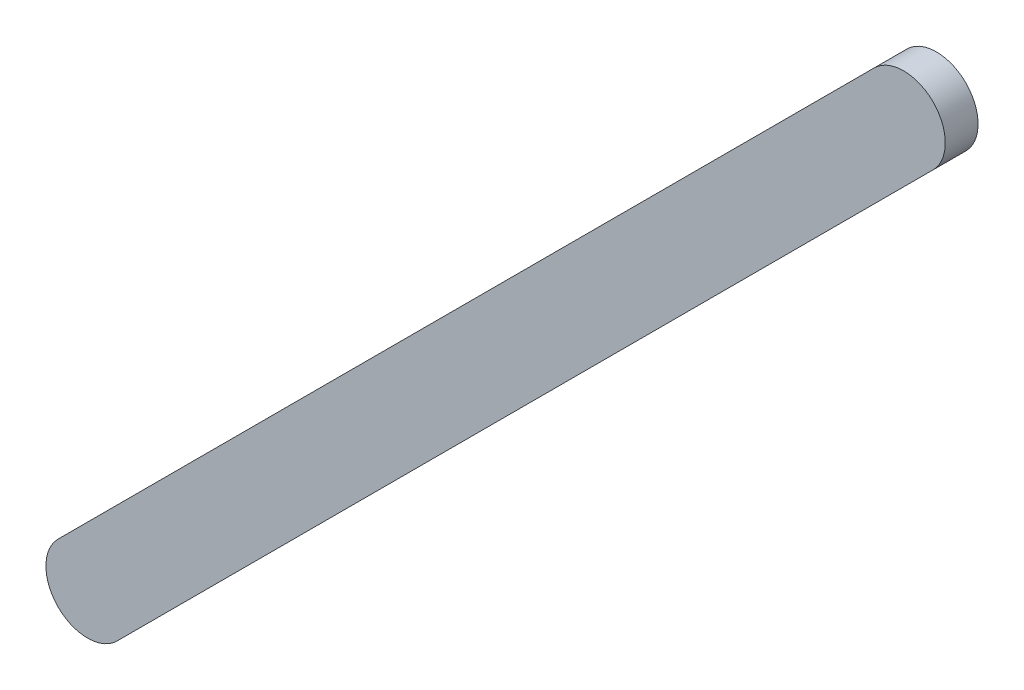
ISO-10303-21;
HEADER;
FILE_DESCRIPTION(('STEP AP214'),'2;1');
FILE_NAME('part.step','',(''),(''),'','','');
FILE_SCHEMA(('AUTOMOTIVE_DESIGN { 1 0 10303 214 1 1 1 1 }'));
ENDSEC;
DATA;
#1=APPLICATION_CONTEXT('core data for automotive mechanical design processes');
#2=APPLICATION_PROTOCOL_DEFINITION('international standard','automotive_design',2000,#1);
#3=PRODUCT_CONTEXT('',#1,'mechanical');
#4=PRODUCT('Part','Part','',(#3));
#5=PRODUCT_RELATED_PRODUCT_CATEGORY('part','',(#4));
#6=PRODUCT_DEFINITION_FORMATION('','',#4);
#7=PRODUCT_DEFINITION_CONTEXT('part definition',#1,'design');
#8=PRODUCT_DEFINITION('design','',#6,#7);
#9=PRODUCT_DEFINITION_SHAPE('','',#8);
#10=(LENGTH_UNIT() NAMED_UNIT(*) SI_UNIT(.MILLI.,.METRE.));
#11=(NAMED_UNIT(*) PLANE_ANGLE_UNIT() SI_UNIT($,.RADIAN.));
#12=(NAMED_UNIT(*) SI_UNIT($,.STERADIAN.) SOLID_ANGLE_UNIT());
#13=UNCERTAINTY_MEASURE_WITH_UNIT(LENGTH_MEASURE(1.E-05),#10,'distance_accuracy_value','');
#14=(GEOMETRIC_REPRESENTATION_CONTEXT(3) GLOBAL_UNCERTAINTY_ASSIGNED_CONTEXT((#13)) GLOBAL_UNIT_ASSIGNED_CONTEXT((#10,
#11,#12)) REPRESENTATION_CONTEXT('',''));
#15=CARTESIAN_POINT('',(0.,0.,0.));
#16=DIRECTION('',(0.,0.,1.));
#17=DIRECTION('',(1.,0.,0.));
#18=AXIS2_PLACEMENT_3D('',#15,#16,#17);
#19=CARTESIAN_POINT('',(123.36960594,113.7393966,0.));
#20=DIRECTION('',(-0.707106781186544,0.707106781186551,0.));
#21=DIRECTION('',(0.707106781186551,0.707106781186544,0.));
#22=AXIS2_PLACEMENT_3D('',#19,#20,#21);
#23=PLANE('',#22);
#24=DIRECTION('',(0.707106781186551,0.707106781186544,0.));
#25=VECTOR('',#24,1.);
#26=CARTESIAN_POINT('',(123.36960594,113.7393966,0.1999996));
#27=LINE('',#26,#25);
#28=CARTESIAN_POINT('',(123.36960594,113.7393966,0.1999996));
#29=VERTEX_POINT('',#28);
#30=CARTESIAN_POINT('',(128.3480034,118.71779406,0.1999996));
#31=VERTEX_POINT('',#30);
#32=EDGE_CURVE('E11',#29,#31,#27,.T.);
#33=ORIENTED_EDGE('',*,*,#32,.F.);
#34=DIRECTION('',(0.,0.,1.));
#35=VECTOR('',#34,1.);
#36=CARTESIAN_POINT('',(123.36960594,113.7393966,0.));
#37=LINE('',#36,#35);
#38=CARTESIAN_POINT('',(123.36960594,113.7393966,0.));
#39=VERTEX_POINT('',#38);
#40=EDGE_CURVE('E24',#39,#29,#37,.T.);
#41=ORIENTED_EDGE('',*,*,#40,.F.);
#42=DIRECTION('',(0.707106781186551,0.707106781186544,0.));
#43=VECTOR('',#42,1.);
#44=CARTESIAN_POINT('',(123.36960594,113.7393966,0.));
#45=LINE('',#44,#43);
#46=CARTESIAN_POINT('',(128.3480034,118.71779406,0.));
#47=VERTEX_POINT('',#46);
#48=EDGE_CURVE('E75',#39,#47,#45,.T.);
#49=ORIENTED_EDGE('',*,*,#48,.T.);
#50=DIRECTION('',(0.,0.,1.));
#51=VECTOR('',#50,1.);
#52=CARTESIAN_POINT('',(128.3480034,118.71779406,0.));
#53=LINE('',#52,#51);
#54=EDGE_CURVE('E37',#47,#31,#53,.T.);
#55=ORIENTED_EDGE('',*,*,#54,.T.);
#56=EDGE_LOOP('',(#33,#41,#49,#55));
#57=FACE_BOUND('',#56,.T.);
#58=ADVANCED_FACE('F17',(#57),#23,.F.);
#59=CARTESIAN_POINT('',(128.16839873,118.89739873,0.));
#60=DIRECTION('',(0.,0.,-1.));
#61=DIRECTION('',(0.707106781186548,-0.707106781186548,0.));
#62=AXIS2_PLACEMENT_3D('',#59,#60,#61);
#63=CYLINDRICAL_SURFACE('',#62,0.253999360179552);
#64=CARTESIAN_POINT('',(128.16839873,118.89739873,0.1999996));
#65=DIRECTION('',(0.,0.,1.));
#66=DIRECTION('',(0.707106781186548,-0.707106781186548,0.));
#67=AXIS2_PLACEMENT_3D('',#64,#65,#66);
#68=CIRCLE('',#67,0.253999360179552);
#69=CARTESIAN_POINT('',(127.98879406,119.0770034,0.1999996));
#70=VERTEX_POINT('',#69);
#71=EDGE_CURVE('E83',#31,#70,#68,.T.);
#72=ORIENTED_EDGE('',*,*,#71,.F.);
#73=ORIENTED_EDGE('',*,*,#54,.F.);
#74=CARTESIAN_POINT('',(128.16839873,118.89739873,0.));
#75=DIRECTION('',(0.,0.,1.));
#76=DIRECTION('',(0.707106781186548,-0.707106781186548,0.));
#77=AXIS2_PLACEMENT_3D('',#74,#75,#76);
#78=CIRCLE('',#77,0.253999360179552);
#79=CARTESIAN_POINT('',(127.98879406,119.0770034,0.));
#80=VERTEX_POINT('',#79);
#81=EDGE_CURVE('E81',#47,#80,#78,.T.);
#82=ORIENTED_EDGE('',*,*,#81,.T.);
#83=DIRECTION('',(0.,0.,1.));
#84=VECTOR('',#83,1.);
#85=CARTESIAN_POINT('',(127.98879406,119.0770034,0.));
#86=LINE('',#85,#84);
#87=EDGE_CURVE('E67',#80,#70,#86,.T.);
#88=ORIENTED_EDGE('',*,*,#87,.T.);
#89=EDGE_LOOP('',(#72,#73,#82,#88));
#90=FACE_BOUND('',#89,.T.);
#91=ADVANCED_FACE('F89',(#90),#63,.T.);
#92=CARTESIAN_POINT('',(127.98879406,119.0770034,0.));
#93=DIRECTION('',(0.70710678118655,-0.707106781186545,0.));
#94=DIRECTION('',(-0.707106781186545,-0.70710678118655,0.));
#95=AXIS2_PLACEMENT_3D('',#92,#93,#94);
#96=PLANE('',#95);
#97=DIRECTION('',(-0.707106781186545,-0.70710678118655,0.));
#98=VECTOR('',#97,1.);
#99=CARTESIAN_POINT('',(127.98879406,119.0770034,0.1999996));
#100=LINE('',#99,#98);
#101=CARTESIAN_POINT('',(123.0103966,114.09860594,0.1999996));
#102=VERTEX_POINT('',#101);
#103=EDGE_CURVE('E71',#70,#102,#100,.T.);
#104=ORIENTED_EDGE('',*,*,#103,.F.);
#105=ORIENTED_EDGE('',*,*,#87,.F.);
#106=DIRECTION('',(-0.707106781186545,-0.70710678118655,0.));
#107=VECTOR('',#106,1.);
#108=CARTESIAN_POINT('',(127.98879406,119.0770034,0.));
#109=LINE('',#108,#107);
#110=CARTESIAN_POINT('',(123.0103966,114.09860594,0.));
#111=VERTEX_POINT('',#110);
#112=EDGE_CURVE('E63',#80,#111,#109,.T.);
#113=ORIENTED_EDGE('',*,*,#112,.T.);
#114=DIRECTION('',(0.,0.,1.));
#115=VECTOR('',#114,1.);
#116=CARTESIAN_POINT('',(123.0103966,114.09860594,0.));
#117=LINE('',#116,#115);
#118=EDGE_CURVE('E53',#111,#102,#117,.T.);
#119=ORIENTED_EDGE('',*,*,#118,.T.);
#120=EDGE_LOOP('',(#104,#105,#113,#119));
#121=FACE_BOUND('',#120,.T.);
#122=ADVANCED_FACE('F66',(#121),#96,.F.);
#123=CARTESIAN_POINT('',(123.19000127,113.91900127,0.));
#124=DIRECTION('',(0.,0.,-1.));
#125=DIRECTION('',(-0.707106781186548,0.707106781186548,0.));
#126=AXIS2_PLACEMENT_3D('',#123,#124,#125);
#127=CYLINDRICAL_SURFACE('',#126,0.253999360179529);
#128=CARTESIAN_POINT('',(123.19000127,113.91900127,0.1999996));
#129=DIRECTION('',(0.,0.,1.));
#130=DIRECTION('',(-0.707106781186548,0.707106781186548,0.));
#131=AXIS2_PLACEMENT_3D('',#128,#129,#130);
#132=CIRCLE('',#131,0.253999360179529);
#133=EDGE_CURVE('E59',#102,#29,#132,.T.);
#134=ORIENTED_EDGE('',*,*,#133,.F.);
#135=ORIENTED_EDGE('',*,*,#118,.F.);
#136=CARTESIAN_POINT('',(123.19000127,113.91900127,0.));
#137=DIRECTION('',(0.,0.,1.));
#138=DIRECTION('',(-0.707106781186548,0.707106781186548,0.));
#139=AXIS2_PLACEMENT_3D('',#136,#137,#138);
#140=CIRCLE('',#139,0.253999360179529);
#141=EDGE_CURVE('E57',#111,#39,#140,.T.);
#142=ORIENTED_EDGE('',*,*,#141,.T.);
#143=ORIENTED_EDGE('',*,*,#40,.T.);
#144=EDGE_LOOP('',(#134,#135,#142,#143));
#145=FACE_BOUND('',#144,.T.);
#146=ADVANCED_FACE('F55',(#145),#127,.T.);
#147=CARTESIAN_POINT('',(123.36960594,113.7393966,0.));
#148=DIRECTION('',(0.,0.,-1.));
#149=DIRECTION('',(-1.,0.,0.));
#150=AXIS2_PLACEMENT_3D('',#147,#148,#149);
#151=PLANE('',#150);
#152=ORIENTED_EDGE('',*,*,#141,.F.);
#153=ORIENTED_EDGE('',*,*,#112,.F.);
#154=ORIENTED_EDGE('',*,*,#81,.F.);
#155=ORIENTED_EDGE('',*,*,#48,.F.);
#156=EDGE_LOOP('',(#152,#153,#154,#155));
#157=FACE_BOUND('',#156,.T.);
#158=ADVANCED_FACE('F74',(#157),#151,.T.);
#159=CARTESIAN_POINT('',(123.36960594,113.7393966,0.1999996));
#160=DIRECTION('',(0.,0.,-1.));
#161=DIRECTION('',(-1.,0.,0.));
#162=AXIS2_PLACEMENT_3D('',#159,#160,#161);
#163=PLANE('',#162);
#164=ORIENTED_EDGE('',*,*,#32,.T.);
#165=ORIENTED_EDGE('',*,*,#71,.T.);
#166=ORIENTED_EDGE('',*,*,#103,.T.);
#167=ORIENTED_EDGE('',*,*,#133,.T.);
#168=EDGE_LOOP('',(#164,#165,#166,#167));
#169=FACE_BOUND('',#168,.T.);
#170=ADVANCED_FACE('F91',(#169),#163,.F.);
#171=CLOSED_SHELL('',(#58,#91,#122,#146,#158,#170));
#172=MANIFOLD_SOLID_BREP('B1',#171);
#173=ADVANCED_BREP_SHAPE_REPRESENTATION('',(#18,#172),#14);
#174=SHAPE_DEFINITION_REPRESENTATION(#9,#173);
ENDSEC;
END-ISO-10303-21;
